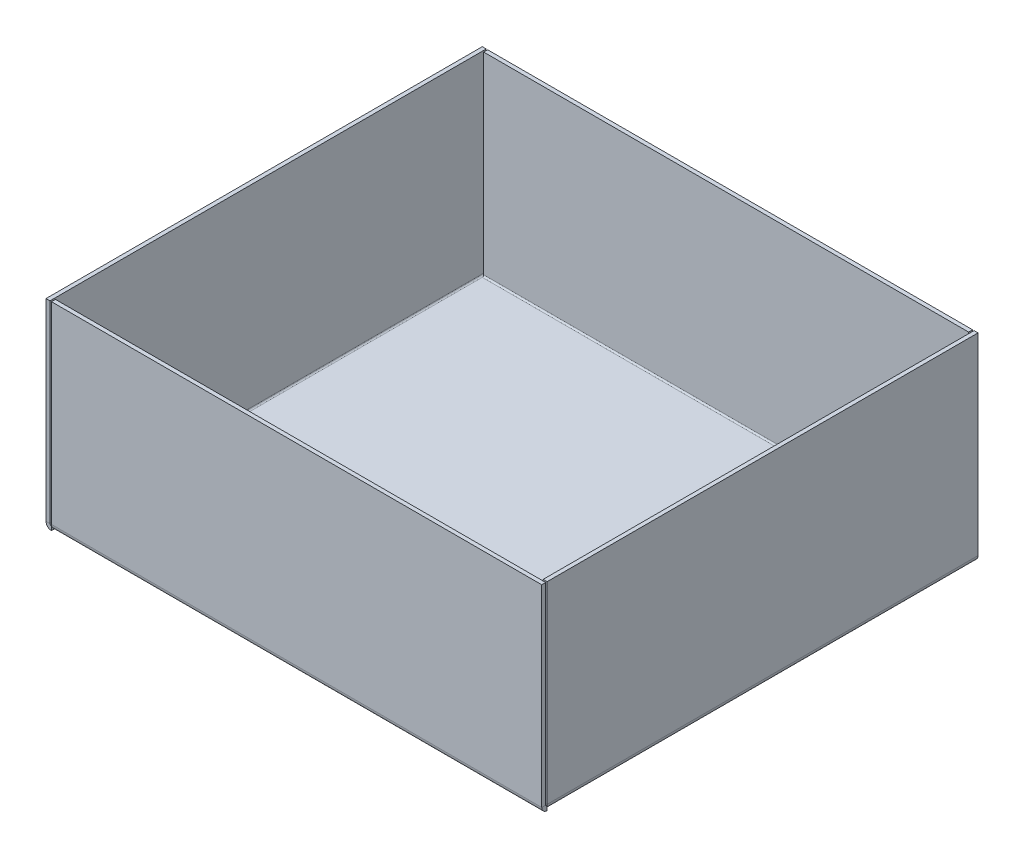
ISO-10303-21;
HEADER;
FILE_DESCRIPTION(('STEP AP214'),'2;1');
FILE_NAME('part.step','',(''),(''),'','','');
FILE_SCHEMA(('AUTOMOTIVE_DESIGN { 1 0 10303 214 1 1 1 1 }'));
ENDSEC;
DATA;
#1=APPLICATION_CONTEXT('core data for automotive mechanical design processes');
#2=APPLICATION_PROTOCOL_DEFINITION('international standard','automotive_design',2000,#1);
#3=PRODUCT_CONTEXT('',#1,'mechanical');
#4=PRODUCT('Part','Part','',(#3));
#5=PRODUCT_RELATED_PRODUCT_CATEGORY('part','',(#4));
#6=PRODUCT_DEFINITION_FORMATION('','',#4);
#7=PRODUCT_DEFINITION_CONTEXT('part definition',#1,'design');
#8=PRODUCT_DEFINITION('design','',#6,#7);
#9=PRODUCT_DEFINITION_SHAPE('','',#8);
#10=(LENGTH_UNIT() NAMED_UNIT(*) SI_UNIT(.MILLI.,.METRE.));
#11=(NAMED_UNIT(*) PLANE_ANGLE_UNIT() SI_UNIT($,.RADIAN.));
#12=(NAMED_UNIT(*) SI_UNIT($,.STERADIAN.) SOLID_ANGLE_UNIT());
#13=UNCERTAINTY_MEASURE_WITH_UNIT(LENGTH_MEASURE(1.E-05),#10,'distance_accuracy_value','');
#14=(GEOMETRIC_REPRESENTATION_CONTEXT(3) GLOBAL_UNCERTAINTY_ASSIGNED_CONTEXT((#13)) GLOBAL_UNIT_ASSIGNED_CONTEXT((#10,
#11,#12)) REPRESENTATION_CONTEXT('',''));
#15=CARTESIAN_POINT('',(0.,0.,0.));
#16=DIRECTION('',(0.,0.,1.));
#17=DIRECTION('',(1.,0.,0.));
#18=AXIS2_PLACEMENT_3D('',#15,#16,#17);
#19=CARTESIAN_POINT('',(-122.2634,0.,-110.));
#20=DIRECTION('',(1.,0.,0.));
#21=DIRECTION('',(0.,0.,-1.));
#22=AXIS2_PLACEMENT_3D('',#19,#20,#21);
#23=PLANE('',#22);
#24=DIRECTION('',(0.,0.,1.));
#25=VECTOR('',#24,1.);
#26=CARTESIAN_POINT('',(-122.2634,0.,-110.));
#27=LINE('',#26,#25);
#28=CARTESIAN_POINT('',(-122.2634,0.,-110.));
#29=VERTEX_POINT('',#28);
#30=CARTESIAN_POINT('',(-122.2634,0.,-109.899002397935));
#31=VERTEX_POINT('',#30);
#32=EDGE_CURVE('E379',#29,#31,#27,.T.);
#33=ORIENTED_EDGE('',*,*,#32,.T.);
#34=CARTESIAN_POINT('',(-122.2634,0.736600000000013,-107.2634));
#35=DIRECTION('',(-1.,0.,0.));
#36=DIRECTION('',(0.,0.,1.));
#37=AXIS2_PLACEMENT_3D('',#34,#35,#36);
#38=CIRCLE('',#37,2.7366);
#39=CARTESIAN_POINT('',(-122.2634,-1.99999999999999,-107.2634));
#40=VERTEX_POINT('',#39);
#41=EDGE_CURVE('E13',#31,#40,#38,.T.);
#42=ORIENTED_EDGE('',*,*,#41,.T.);
#43=DIRECTION('',(0.,0.,1.));
#44=VECTOR('',#43,1.);
#45=CARTESIAN_POINT('',(-122.2634,-2.,110.));
#46=LINE('',#45,#44);
#47=CARTESIAN_POINT('',(-122.2634,-2.,-110.));
#48=VERTEX_POINT('',#47);
#49=EDGE_CURVE('E383',#48,#40,#46,.T.);
#50=ORIENTED_EDGE('',*,*,#49,.F.);
#51=DIRECTION('',(0.,-1.,0.));
#52=VECTOR('',#51,1.);
#53=CARTESIAN_POINT('',(-122.2634,0.,-110.));
#54=LINE('',#53,#52);
#55=EDGE_CURVE('E131',#29,#48,#54,.T.);
#56=ORIENTED_EDGE('',*,*,#55,.F.);
#57=EDGE_LOOP('',(#33,#42,#50,#56));
#58=FACE_BOUND('',#57,.T.);
#59=ADVANCED_FACE('F121',(#58),#23,.T.);
#60=CARTESIAN_POINT('',(122.2634,0.,-107.2634));
#61=DIRECTION('',(-1.,0.,0.));
#62=DIRECTION('',(0.,0.,1.));
#63=AXIS2_PLACEMENT_3D('',#60,#61,#62);
#64=PLANE('',#63);
#65=DIRECTION('',(0.,0.,-1.));
#66=VECTOR('',#65,1.);
#67=CARTESIAN_POINT('',(122.2634,-1.99999999999999,-110.));
#68=LINE('',#67,#66);
#69=CARTESIAN_POINT('',(122.2634,-1.99999999999999,-110.));
#70=VERTEX_POINT('',#69);
#71=CARTESIAN_POINT('',(122.2634,-1.99999999999999,-107.2634));
#72=VERTEX_POINT('',#71);
#73=EDGE_CURVE('E432',#70,#72,#68,.F.);
#74=ORIENTED_EDGE('',*,*,#73,.T.);
#75=CARTESIAN_POINT('',(122.2634,0.736600000000013,-107.2634));
#76=DIRECTION('',(-1.,0.,0.));
#77=DIRECTION('',(0.,0.,1.));
#78=AXIS2_PLACEMENT_3D('',#75,#76,#77);
#79=CIRCLE('',#78,2.7366);
#80=CARTESIAN_POINT('',(122.2634,0.,-109.899002397935));
#81=VERTEX_POINT('',#80);
#82=EDGE_CURVE('E367',#72,#81,#79,.F.);
#83=ORIENTED_EDGE('',*,*,#82,.T.);
#84=DIRECTION('',(0.,0.,-1.));
#85=VECTOR('',#84,1.);
#86=CARTESIAN_POINT('',(122.2634,0.,-110.));
#87=LINE('',#86,#85);
#88=CARTESIAN_POINT('',(122.2634,0.,-110.));
#89=VERTEX_POINT('',#88);
#90=EDGE_CURVE('E450',#89,#81,#87,.F.);
#91=ORIENTED_EDGE('',*,*,#90,.F.);
#92=DIRECTION('',(0.,-1.,0.));
#93=VECTOR('',#92,1.);
#94=CARTESIAN_POINT('',(122.2634,0.,-110.));
#95=LINE('',#94,#93);
#96=EDGE_CURVE('E442',#89,#70,#95,.T.);
#97=ORIENTED_EDGE('',*,*,#96,.T.);
#98=EDGE_LOOP('',(#74,#83,#91,#97));
#99=FACE_BOUND('',#98,.T.);
#100=ADVANCED_FACE('F656',(#99),#64,.T.);
#101=CARTESIAN_POINT('',(0.,-2.,0.));
#102=DIRECTION('',(0.,-1.,0.));
#103=DIRECTION('',(0.,0.,-1.));
#104=AXIS2_PLACEMENT_3D('',#101,#102,#103);
#105=PLANE('',#104);
#106=DIRECTION('',(0.,0.,1.));
#107=VECTOR('',#106,1.);
#108=CARTESIAN_POINT('',(-122.2634,-2.,110.));
#109=LINE('',#108,#107);
#110=CARTESIAN_POINT('',(-122.2634,-2.,107.2634));
#111=VERTEX_POINT('',#110);
#112=EDGE_CURVE('E585',#111,#40,#109,.F.);
#113=ORIENTED_EDGE('',*,*,#112,.T.);
#114=DIRECTION('',(-1.,0.,0.));
#115=VECTOR('',#114,1.);
#116=CARTESIAN_POINT('',(-122.2634,-1.99999999999999,-107.2634));
#117=LINE('',#116,#115);
#118=EDGE_CURVE('E309',#40,#72,#117,.F.);
#119=ORIENTED_EDGE('',*,*,#118,.T.);
#120=CARTESIAN_POINT('',(122.2634,-1.99999999999999,107.2634));
#121=VERTEX_POINT('',#120);
#122=EDGE_CURVE('E437',#72,#121,#68,.F.);
#123=ORIENTED_EDGE('',*,*,#122,.T.);
#124=DIRECTION('',(1.,0.,0.));
#125=VECTOR('',#124,1.);
#126=CARTESIAN_POINT('',(125.,-2.,107.2634));
#127=LINE('',#126,#125);
#128=EDGE_CURVE('E510',#121,#111,#127,.F.);
#129=ORIENTED_EDGE('',*,*,#128,.T.);
#130=EDGE_LOOP('',(#113,#119,#123,#129));
#131=FACE_BOUND('',#130,.T.);
#132=ADVANCED_FACE('F662',(#131),#105,.T.);
#133=CARTESIAN_POINT('',(0.,0.,0.));
#134=DIRECTION('',(0.,-1.,0.));
#135=DIRECTION('',(0.,0.,-1.));
#136=AXIS2_PLACEMENT_3D('',#133,#134,#135);
#137=PLANE('',#136);
#138=DIRECTION('',(-1.,0.,0.));
#139=VECTOR('',#138,1.);
#140=CARTESIAN_POINT('',(-122.2634,0.,-107.2634));
#141=LINE('',#140,#139);
#142=CARTESIAN_POINT('',(-122.2634,0.,-107.2634));
#143=VERTEX_POINT('',#142);
#144=CARTESIAN_POINT('',(122.2634,0.,-107.2634));
#145=VERTEX_POINT('',#144);
#146=EDGE_CURVE('E374',#143,#145,#141,.F.);
#147=ORIENTED_EDGE('',*,*,#146,.F.);
#148=DIRECTION('',(0.,0.,1.));
#149=VECTOR('',#148,1.);
#150=CARTESIAN_POINT('',(-122.2634,0.,110.));
#151=LINE('',#150,#149);
#152=CARTESIAN_POINT('',(-122.2634,0.,107.2634));
#153=VERTEX_POINT('',#152);
#154=EDGE_CURVE('E602',#153,#143,#151,.F.);
#155=ORIENTED_EDGE('',*,*,#154,.F.);
#156=DIRECTION('',(1.,0.,0.));
#157=VECTOR('',#156,1.);
#158=CARTESIAN_POINT('',(125.,0.,107.2634));
#159=LINE('',#158,#157);
#160=CARTESIAN_POINT('',(122.2634,0.,107.2634));
#161=VERTEX_POINT('',#160);
#162=EDGE_CURVE('E529',#161,#153,#159,.F.);
#163=ORIENTED_EDGE('',*,*,#162,.F.);
#164=EDGE_CURVE('E148',#145,#161,#87,.F.);
#165=ORIENTED_EDGE('',*,*,#164,.F.);
#166=EDGE_LOOP('',(#147,#155,#163,#165));
#167=FACE_BOUND('',#166,.T.);
#168=ADVANCED_FACE('F123',(#167),#137,.F.);
#169=CARTESIAN_POINT('',(122.2634,0.,107.2634));
#170=DIRECTION('',(0.,0.,-1.));
#171=DIRECTION('',(0.,1.,0.));
#172=AXIS2_PLACEMENT_3D('',#169,#170,#171);
#173=PLANE('',#172);
#174=CARTESIAN_POINT('',(125.,-2.,107.2634));
#175=VERTEX_POINT('',#174);
#176=EDGE_CURVE('E505',#175,#121,#127,.F.);
#177=ORIENTED_EDGE('',*,*,#176,.T.);
#178=CARTESIAN_POINT('',(122.2634,0.736600000000013,107.2634));
#179=DIRECTION('',(0.,0.,-1.));
#180=DIRECTION('',(-1.,0.,0.));
#181=AXIS2_PLACEMENT_3D('',#178,#179,#180);
#182=CIRCLE('',#181,2.7366);
#183=CARTESIAN_POINT('',(124.899002397935,0.,107.2634));
#184=VERTEX_POINT('',#183);
#185=EDGE_CURVE('E438',#121,#184,#182,.F.);
#186=ORIENTED_EDGE('',*,*,#185,.T.);
#187=CARTESIAN_POINT('',(125.,0.,107.2634));
#188=VERTEX_POINT('',#187);
#189=EDGE_CURVE('E524',#188,#184,#159,.F.);
#190=ORIENTED_EDGE('',*,*,#189,.F.);
#191=DIRECTION('',(0.,-1.,0.));
#192=VECTOR('',#191,1.);
#193=CARTESIAN_POINT('',(125.,0.,107.2634));
#194=LINE('',#193,#192);
#195=EDGE_CURVE('E515',#188,#175,#194,.T.);
#196=ORIENTED_EDGE('',*,*,#195,.T.);
#197=EDGE_LOOP('',(#177,#186,#190,#196));
#198=FACE_BOUND('',#197,.T.);
#199=ADVANCED_FACE('F704',(#198),#173,.T.);
#200=CARTESIAN_POINT('',(-122.2634,0.,107.2634));
#201=DIRECTION('',(1.,0.,0.));
#202=DIRECTION('',(0.,0.,-1.));
#203=AXIS2_PLACEMENT_3D('',#200,#201,#202);
#204=PLANE('',#203);
#205=CARTESIAN_POINT('',(-122.2634,-2.,110.));
#206=VERTEX_POINT('',#205);
#207=EDGE_CURVE('E580',#206,#111,#109,.F.);
#208=ORIENTED_EDGE('',*,*,#207,.T.);
#209=CARTESIAN_POINT('',(-122.2634,0.736600000000004,107.2634));
#210=DIRECTION('',(1.,0.,0.));
#211=DIRECTION('',(0.,0.,-1.));
#212=AXIS2_PLACEMENT_3D('',#209,#210,#211);
#213=CIRCLE('',#212,2.7366);
#214=CARTESIAN_POINT('',(-122.2634,0.,109.899002397935));
#215=VERTEX_POINT('',#214);
#216=EDGE_CURVE('E511',#111,#215,#213,.F.);
#217=ORIENTED_EDGE('',*,*,#216,.T.);
#218=CARTESIAN_POINT('',(-122.2634,0.,110.));
#219=VERTEX_POINT('',#218);
#220=EDGE_CURVE('E597',#219,#215,#151,.F.);
#221=ORIENTED_EDGE('',*,*,#220,.F.);
#222=DIRECTION('',(0.,-1.,0.));
#223=VECTOR('',#222,1.);
#224=CARTESIAN_POINT('',(-122.2634,0.,110.));
#225=LINE('',#224,#223);
#226=EDGE_CURVE('E125',#219,#206,#225,.T.);
#227=ORIENTED_EDGE('',*,*,#226,.T.);
#228=EDGE_LOOP('',(#208,#217,#221,#227));
#229=FACE_BOUND('',#228,.T.);
#230=ADVANCED_FACE('F613',(#229),#204,.T.);
#231=CARTESIAN_POINT('',(-122.2634,0.736600000000006,-110.));
#232=DIRECTION('',(0.,0.,-1.));
#233=DIRECTION('',(-1.,0.,0.));
#234=AXIS2_PLACEMENT_3D('',#231,#232,#233);
#235=PLANE('',#234);
#236=DIRECTION('',(-1.,0.,0.));
#237=VECTOR('',#236,1.);
#238=CARTESIAN_POINT('',(-125.,0.736600000000004,-110.));
#239=LINE('',#238,#237);
#240=CARTESIAN_POINT('',(-123.,0.736600000000004,-110.));
#241=VERTEX_POINT('',#240);
#242=CARTESIAN_POINT('',(-125.,0.736599999999997,-110.));
#243=VERTEX_POINT('',#242);
#244=EDGE_CURVE('E535',#241,#243,#239,.T.);
#245=ORIENTED_EDGE('',*,*,#244,.F.);
#246=CARTESIAN_POINT('',(-122.2634,0.736600000000006,-110.));
#247=DIRECTION('',(0.,0.,1.));
#248=DIRECTION('',(1.,0.,0.));
#249=AXIS2_PLACEMENT_3D('',#246,#247,#248);
#250=CIRCLE('',#249,0.736600000000004);
#251=EDGE_CURVE('E593',#29,#241,#250,.F.);
#252=ORIENTED_EDGE('',*,*,#251,.F.);
#253=ORIENTED_EDGE('',*,*,#55,.T.);
#254=CARTESIAN_POINT('',(-122.2634,0.736600000000006,-110.));
#255=DIRECTION('',(0.,0.,1.));
#256=DIRECTION('',(1.,0.,0.));
#257=AXIS2_PLACEMENT_3D('',#254,#255,#256);
#258=CIRCLE('',#257,2.7366);
#259=EDGE_CURVE('E584',#48,#243,#258,.F.);
#260=ORIENTED_EDGE('',*,*,#259,.T.);
#261=EDGE_LOOP('',(#245,#252,#253,#260));
#262=FACE_BOUND('',#261,.T.);
#263=ADVANCED_FACE('F638',(#262),#235,.T.);
#264=CARTESIAN_POINT('',(-122.2634,0.736600000000006,110.));
#265=DIRECTION('',(0.,0.,-1.));
#266=DIRECTION('',(-1.,0.,0.));
#267=AXIS2_PLACEMENT_3D('',#264,#265,#266);
#268=PLANE('',#267);
#269=CARTESIAN_POINT('',(-122.2634,0.736600000000006,110.));
#270=DIRECTION('',(0.,0.,1.));
#271=DIRECTION('',(1.,0.,0.));
#272=AXIS2_PLACEMENT_3D('',#269,#270,#271);
#273=CIRCLE('',#272,0.736600000000004);
#274=CARTESIAN_POINT('',(-123.,0.736600000000004,110.));
#275=VERTEX_POINT('',#274);
#276=EDGE_CURVE('E539',#275,#219,#273,.T.);
#277=ORIENTED_EDGE('',*,*,#276,.F.);
#278=DIRECTION('',(-1.,0.,0.));
#279=VECTOR('',#278,1.);
#280=CARTESIAN_POINT('',(-123.,0.736600000000004,110.));
#281=LINE('',#280,#279);
#282=CARTESIAN_POINT('',(-125.,0.736599999999997,110.));
#283=VERTEX_POINT('',#282);
#284=EDGE_CURVE('E570',#275,#283,#281,.T.);
#285=ORIENTED_EDGE('',*,*,#284,.T.);
#286=CARTESIAN_POINT('',(-122.2634,0.736600000000006,110.));
#287=DIRECTION('',(0.,0.,1.));
#288=DIRECTION('',(1.,0.,0.));
#289=AXIS2_PLACEMENT_3D('',#286,#287,#288);
#290=CIRCLE('',#289,2.7366);
#291=EDGE_CURVE('E589',#283,#206,#290,.T.);
#292=ORIENTED_EDGE('',*,*,#291,.T.);
#293=ORIENTED_EDGE('',*,*,#226,.F.);
#294=EDGE_LOOP('',(#277,#285,#292,#293));
#295=FACE_BOUND('',#294,.T.);
#296=ADVANCED_FACE('F620',(#295),#268,.F.);
#297=CARTESIAN_POINT('',(-122.2634,0.736600000000006,110.));
#298=DIRECTION('',(0.,0.,1.));
#299=DIRECTION('',(-1.,0.,0.));
#300=AXIS2_PLACEMENT_3D('',#297,#298,#299);
#301=CYLINDRICAL_SURFACE('',#300,2.7366);
#302=ORIENTED_EDGE('',*,*,#207,.F.);
#303=ORIENTED_EDGE('',*,*,#291,.F.);
#304=DIRECTION('',(0.,0.,1.));
#305=VECTOR('',#304,1.);
#306=CARTESIAN_POINT('',(-125.,0.736599999999997,0.));
#307=LINE('',#306,#305);
#308=EDGE_CURVE('E566',#243,#283,#307,.T.);
#309=ORIENTED_EDGE('',*,*,#308,.F.);
#310=ORIENTED_EDGE('',*,*,#259,.F.);
#311=ORIENTED_EDGE('',*,*,#49,.T.);
#312=ORIENTED_EDGE('',*,*,#112,.F.);
#313=EDGE_LOOP('',(#302,#303,#309,#310,#311,#312));
#314=FACE_BOUND('',#313,.T.);
#315=ADVANCED_FACE('F618',(#314),#301,.T.);
#316=CARTESIAN_POINT('',(-122.2634,0.736600000000006,110.));
#317=DIRECTION('',(0.,0.,1.));
#318=DIRECTION('',(-1.,0.,0.));
#319=AXIS2_PLACEMENT_3D('',#316,#317,#318);
#320=CYLINDRICAL_SURFACE('',#319,0.736600000000004);
#321=ORIENTED_EDGE('',*,*,#220,.T.);
#322=EDGE_CURVE('E601',#215,#153,#151,.F.);
#323=ORIENTED_EDGE('',*,*,#322,.T.);
#324=ORIENTED_EDGE('',*,*,#154,.T.);
#325=EDGE_CURVE('E370',#31,#143,#27,.T.);
#326=ORIENTED_EDGE('',*,*,#325,.F.);
#327=ORIENTED_EDGE('',*,*,#32,.F.);
#328=ORIENTED_EDGE('',*,*,#251,.T.);
#329=DIRECTION('',(0.,0.,-1.));
#330=VECTOR('',#329,1.);
#331=CARTESIAN_POINT('',(-123.,0.736600000000004,-110.));
#332=LINE('',#331,#330);
#333=EDGE_CURVE('E574',#241,#275,#332,.F.);
#334=ORIENTED_EDGE('',*,*,#333,.T.);
#335=ORIENTED_EDGE('',*,*,#276,.T.);
#336=EDGE_LOOP('',(#321,#323,#324,#326,#327,#328,#334,#335));
#337=FACE_BOUND('',#336,.T.);
#338=ADVANCED_FACE('F642',(#337),#320,.F.);
#339=CARTESIAN_POINT('',(-125.,0.,110.));
#340=DIRECTION('',(0.,0.,1.));
#341=DIRECTION('',(1.,0.,0.));
#342=AXIS2_PLACEMENT_3D('',#339,#340,#341);
#343=PLANE('',#342);
#344=DIRECTION('',(0.,-1.,0.));
#345=VECTOR('',#344,1.);
#346=CARTESIAN_POINT('',(-125.,0.,110.));
#347=LINE('',#346,#345);
#348=CARTESIAN_POINT('',(-125.,98.,110.));
#349=VERTEX_POINT('',#348);
#350=EDGE_CURVE('E544',#349,#283,#347,.T.);
#351=ORIENTED_EDGE('',*,*,#350,.T.);
#352=ORIENTED_EDGE('',*,*,#284,.F.);
#353=DIRECTION('',(0.,1.,0.));
#354=VECTOR('',#353,1.);
#355=CARTESIAN_POINT('',(-123.,-4.24830239014728E-13,110.));
#356=LINE('',#355,#354);
#357=CARTESIAN_POINT('',(-123.,98.,110.));
#358=VERTEX_POINT('',#357);
#359=EDGE_CURVE('E555',#358,#275,#356,.F.);
#360=ORIENTED_EDGE('',*,*,#359,.F.);
#361=DIRECTION('',(1.,0.,0.));
#362=VECTOR('',#361,1.);
#363=CARTESIAN_POINT('',(-125.,98.,110.));
#364=LINE('',#363,#362);
#365=EDGE_CURVE('E536',#349,#358,#364,.T.);
#366=ORIENTED_EDGE('',*,*,#365,.F.);
#367=EDGE_LOOP('',(#351,#352,#360,#366));
#368=FACE_BOUND('',#367,.T.);
#369=ADVANCED_FACE('F630',(#368),#343,.T.);
#370=CARTESIAN_POINT('',(-125.,98.,-110.));
#371=DIRECTION('',(0.,0.,-1.));
#372=DIRECTION('',(-1.,0.,0.));
#373=AXIS2_PLACEMENT_3D('',#370,#371,#372);
#374=PLANE('',#373);
#375=DIRECTION('',(0.,-1.,0.));
#376=VECTOR('',#375,1.);
#377=CARTESIAN_POINT('',(-123.,-4.24830239014728E-13,-110.));
#378=LINE('',#377,#376);
#379=CARTESIAN_POINT('',(-123.,98.,-110.));
#380=VERTEX_POINT('',#379);
#381=EDGE_CURVE('E563',#241,#380,#378,.F.);
#382=ORIENTED_EDGE('',*,*,#381,.F.);
#383=ORIENTED_EDGE('',*,*,#244,.T.);
#384=DIRECTION('',(0.,1.,0.));
#385=VECTOR('',#384,1.);
#386=CARTESIAN_POINT('',(-125.,98.,-110.));
#387=LINE('',#386,#385);
#388=CARTESIAN_POINT('',(-125.,98.,-110.));
#389=VERTEX_POINT('',#388);
#390=EDGE_CURVE('E552',#243,#389,#387,.T.);
#391=ORIENTED_EDGE('',*,*,#390,.T.);
#392=DIRECTION('',(1.,0.,0.));
#393=VECTOR('',#392,1.);
#394=CARTESIAN_POINT('',(-125.,98.,-110.));
#395=LINE('',#394,#393);
#396=EDGE_CURVE('E540',#389,#380,#395,.T.);
#397=ORIENTED_EDGE('',*,*,#396,.T.);
#398=EDGE_LOOP('',(#382,#383,#391,#397));
#399=FACE_BOUND('',#398,.T.);
#400=ADVANCED_FACE('F637',(#399),#374,.T.);
#401=CARTESIAN_POINT('',(-125.,-4.31813201692414E-13,0.));
#402=DIRECTION('',(-1.,0.,0.));
#403=DIRECTION('',(0.,-1.,0.));
#404=AXIS2_PLACEMENT_3D('',#401,#402,#403);
#405=PLANE('',#404);
#406=ORIENTED_EDGE('',*,*,#390,.F.);
#407=ORIENTED_EDGE('',*,*,#308,.T.);
#408=ORIENTED_EDGE('',*,*,#350,.F.);
#409=DIRECTION('',(0.,0.,1.));
#410=VECTOR('',#409,1.);
#411=CARTESIAN_POINT('',(-125.,98.,110.));
#412=LINE('',#411,#410);
#413=EDGE_CURVE('E548',#389,#349,#412,.T.);
#414=ORIENTED_EDGE('',*,*,#413,.F.);
#415=EDGE_LOOP('',(#406,#407,#408,#414));
#416=FACE_BOUND('',#415,.T.);
#417=ADVANCED_FACE('F627',(#416),#405,.T.);
#418=CARTESIAN_POINT('',(-123.,-4.24830239014728E-13,0.));
#419=DIRECTION('',(-1.,0.,0.));
#420=DIRECTION('',(0.,-1.,0.));
#421=AXIS2_PLACEMENT_3D('',#418,#419,#420);
#422=PLANE('',#421);
#423=ORIENTED_EDGE('',*,*,#333,.F.);
#424=ORIENTED_EDGE('',*,*,#381,.T.);
#425=DIRECTION('',(0.,0.,-1.));
#426=VECTOR('',#425,1.);
#427=CARTESIAN_POINT('',(-123.,98.,0.));
#428=LINE('',#427,#426);
#429=EDGE_CURVE('E559',#380,#358,#428,.F.);
#430=ORIENTED_EDGE('',*,*,#429,.T.);
#431=ORIENTED_EDGE('',*,*,#359,.T.);
#432=EDGE_LOOP('',(#423,#424,#430,#431));
#433=FACE_BOUND('',#432,.T.);
#434=ADVANCED_FACE('F644',(#433),#422,.F.);
#435=CARTESIAN_POINT('',(-125.,98.,110.));
#436=DIRECTION('',(0.,1.,0.));
#437=DIRECTION('',(-1.,0.,0.));
#438=AXIS2_PLACEMENT_3D('',#435,#436,#437);
#439=PLANE('',#438);
#440=ORIENTED_EDGE('',*,*,#429,.F.);
#441=ORIENTED_EDGE('',*,*,#396,.F.);
#442=ORIENTED_EDGE('',*,*,#413,.T.);
#443=ORIENTED_EDGE('',*,*,#365,.T.);
#444=EDGE_LOOP('',(#440,#441,#442,#443));
#445=FACE_BOUND('',#444,.T.);
#446=ADVANCED_FACE('F634',(#445),#439,.T.);
#447=CARTESIAN_POINT('',(-122.2634,0.736600000000004,107.2634));
#448=DIRECTION('',(-1.,0.,0.));
#449=DIRECTION('',(0.,0.,1.));
#450=AXIS2_PLACEMENT_3D('',#447,#448,#449);
#451=PLANE('',#450);
#452=ORIENTED_EDGE('',*,*,#322,.F.);
#453=CARTESIAN_POINT('',(-122.2634,0.736599999999994,110.));
#454=VERTEX_POINT('',#453);
#455=EDGE_CURVE('E509',#215,#454,#213,.F.);
#456=ORIENTED_EDGE('',*,*,#455,.T.);
#457=DIRECTION('',(0.,0.,1.));
#458=VECTOR('',#457,1.);
#459=CARTESIAN_POINT('',(-122.2634,0.736600000000004,110.));
#460=LINE('',#459,#458);
#461=CARTESIAN_POINT('',(-122.2634,0.736600000000001,108.));
#462=VERTEX_POINT('',#461);
#463=EDGE_CURVE('E460',#462,#454,#460,.T.);
#464=ORIENTED_EDGE('',*,*,#463,.F.);
#465=CARTESIAN_POINT('',(-122.2634,0.736600000000004,107.2634));
#466=DIRECTION('',(1.,0.,0.));
#467=DIRECTION('',(0.,0.,-1.));
#468=AXIS2_PLACEMENT_3D('',#465,#466,#467);
#469=CIRCLE('',#468,0.736600000000004);
#470=EDGE_CURVE('E520',#153,#462,#469,.F.);
#471=ORIENTED_EDGE('',*,*,#470,.F.);
#472=EDGE_LOOP('',(#452,#456,#464,#471));
#473=FACE_BOUND('',#472,.T.);
#474=ADVANCED_FACE('F651',(#473),#451,.T.);
#475=CARTESIAN_POINT('',(125.,0.736600000000004,107.2634));
#476=DIRECTION('',(-1.,0.,0.));
#477=DIRECTION('',(0.,0.,1.));
#478=AXIS2_PLACEMENT_3D('',#475,#476,#477);
#479=PLANE('',#478);
#480=CARTESIAN_POINT('',(125.,0.736600000000004,107.2634));
#481=DIRECTION('',(1.,0.,0.));
#482=DIRECTION('',(0.,0.,-1.));
#483=AXIS2_PLACEMENT_3D('',#480,#481,#482);
#484=CIRCLE('',#483,0.736600000000004);
#485=CARTESIAN_POINT('',(125.,0.736600000000001,108.));
#486=VERTEX_POINT('',#485);
#487=EDGE_CURVE('E464',#486,#188,#484,.T.);
#488=ORIENTED_EDGE('',*,*,#487,.F.);
#489=DIRECTION('',(0.,0.,1.));
#490=VECTOR('',#489,1.);
#491=CARTESIAN_POINT('',(125.,0.736600000000004,108.));
#492=LINE('',#491,#490);
#493=CARTESIAN_POINT('',(125.,0.736600000000004,110.));
#494=VERTEX_POINT('',#493);
#495=EDGE_CURVE('E495',#486,#494,#492,.T.);
#496=ORIENTED_EDGE('',*,*,#495,.T.);
#497=CARTESIAN_POINT('',(125.,0.736600000000004,107.2634));
#498=DIRECTION('',(1.,0.,0.));
#499=DIRECTION('',(0.,0.,-1.));
#500=AXIS2_PLACEMENT_3D('',#497,#498,#499);
#501=CIRCLE('',#500,2.7366);
#502=EDGE_CURVE('E516',#494,#175,#501,.T.);
#503=ORIENTED_EDGE('',*,*,#502,.T.);
#504=ORIENTED_EDGE('',*,*,#195,.F.);
#505=EDGE_LOOP('',(#488,#496,#503,#504));
#506=FACE_BOUND('',#505,.T.);
#507=ADVANCED_FACE('F731',(#506),#479,.F.);
#508=CARTESIAN_POINT('',(125.,0.736600000000004,107.2634));
#509=DIRECTION('',(1.,0.,0.));
#510=DIRECTION('',(0.,0.,1.));
#511=AXIS2_PLACEMENT_3D('',#508,#509,#510);
#512=CYLINDRICAL_SURFACE('',#511,2.7366);
#513=ORIENTED_EDGE('',*,*,#176,.F.);
#514=ORIENTED_EDGE('',*,*,#502,.F.);
#515=DIRECTION('',(1.,0.,0.));
#516=VECTOR('',#515,1.);
#517=CARTESIAN_POINT('',(0.,0.736600000000004,110.));
#518=LINE('',#517,#516);
#519=EDGE_CURVE('E491',#454,#494,#518,.T.);
#520=ORIENTED_EDGE('',*,*,#519,.F.);
#521=ORIENTED_EDGE('',*,*,#455,.F.);
#522=ORIENTED_EDGE('',*,*,#216,.F.);
#523=ORIENTED_EDGE('',*,*,#128,.F.);
#524=EDGE_LOOP('',(#513,#514,#520,#521,#522,#523));
#525=FACE_BOUND('',#524,.T.);
#526=ADVANCED_FACE('F728',(#525),#512,.T.);
#527=CARTESIAN_POINT('',(125.,0.736600000000004,107.2634));
#528=DIRECTION('',(1.,0.,0.));
#529=DIRECTION('',(0.,0.,1.));
#530=AXIS2_PLACEMENT_3D('',#527,#528,#529);
#531=CYLINDRICAL_SURFACE('',#530,0.736600000000004);
#532=ORIENTED_EDGE('',*,*,#189,.T.);
#533=EDGE_CURVE('E528',#184,#161,#159,.F.);
#534=ORIENTED_EDGE('',*,*,#533,.T.);
#535=ORIENTED_EDGE('',*,*,#162,.T.);
#536=ORIENTED_EDGE('',*,*,#470,.T.);
#537=DIRECTION('',(-1.,0.,0.));
#538=VECTOR('',#537,1.);
#539=CARTESIAN_POINT('',(-122.2634,0.736600000000004,108.));
#540=LINE('',#539,#538);
#541=EDGE_CURVE('E499',#462,#486,#540,.F.);
#542=ORIENTED_EDGE('',*,*,#541,.T.);
#543=ORIENTED_EDGE('',*,*,#487,.T.);
#544=EDGE_LOOP('',(#532,#534,#535,#536,#542,#543));
#545=FACE_BOUND('',#544,.T.);
#546=ADVANCED_FACE('F720',(#545),#531,.F.);
#547=CARTESIAN_POINT('',(125.,0.,110.));
#548=DIRECTION('',(1.,0.,0.));
#549=DIRECTION('',(0.,0.,-1.));
#550=AXIS2_PLACEMENT_3D('',#547,#548,#549);
#551=PLANE('',#550);
#552=DIRECTION('',(0.,-1.,0.));
#553=VECTOR('',#552,1.);
#554=CARTESIAN_POINT('',(125.,0.,110.));
#555=LINE('',#554,#553);
#556=CARTESIAN_POINT('',(125.,98.,110.));
#557=VERTEX_POINT('',#556);
#558=EDGE_CURVE('E469',#557,#494,#555,.T.);
#559=ORIENTED_EDGE('',*,*,#558,.T.);
#560=ORIENTED_EDGE('',*,*,#495,.F.);
#561=DIRECTION('',(0.,1.,0.));
#562=VECTOR('',#561,1.);
#563=CARTESIAN_POINT('',(125.,-3.89427719096834E-13,108.));
#564=LINE('',#563,#562);
#565=CARTESIAN_POINT('',(125.,98.,108.));
#566=VERTEX_POINT('',#565);
#567=EDGE_CURVE('E480',#566,#486,#564,.F.);
#568=ORIENTED_EDGE('',*,*,#567,.F.);
#569=DIRECTION('',(0.,0.,-1.));
#570=VECTOR('',#569,1.);
#571=CARTESIAN_POINT('',(125.,98.,110.));
#572=LINE('',#571,#570);
#573=EDGE_CURVE('E461',#557,#566,#572,.T.);
#574=ORIENTED_EDGE('',*,*,#573,.F.);
#575=EDGE_LOOP('',(#559,#560,#568,#574));
#576=FACE_BOUND('',#575,.T.);
#577=ADVANCED_FACE('F717',(#576),#551,.T.);
#578=CARTESIAN_POINT('',(-122.2634,98.,110.));
#579=DIRECTION('',(-1.,0.,0.));
#580=DIRECTION('',(0.,0.,1.));
#581=AXIS2_PLACEMENT_3D('',#578,#579,#580);
#582=PLANE('',#581);
#583=DIRECTION('',(0.,-1.,0.));
#584=VECTOR('',#583,1.);
#585=CARTESIAN_POINT('',(-122.2634,-3.89427719096834E-13,108.));
#586=LINE('',#585,#584);
#587=CARTESIAN_POINT('',(-122.2634,98.,108.));
#588=VERTEX_POINT('',#587);
#589=EDGE_CURVE('E488',#462,#588,#586,.F.);
#590=ORIENTED_EDGE('',*,*,#589,.F.);
#591=ORIENTED_EDGE('',*,*,#463,.T.);
#592=DIRECTION('',(0.,1.,0.));
#593=VECTOR('',#592,1.);
#594=CARTESIAN_POINT('',(-122.2634,98.,110.));
#595=LINE('',#594,#593);
#596=CARTESIAN_POINT('',(-122.2634,98.,110.));
#597=VERTEX_POINT('',#596);
#598=EDGE_CURVE('E477',#454,#597,#595,.T.);
#599=ORIENTED_EDGE('',*,*,#598,.T.);
#600=DIRECTION('',(0.,0.,-1.));
#601=VECTOR('',#600,1.);
#602=CARTESIAN_POINT('',(-122.2634,98.,110.));
#603=LINE('',#602,#601);
#604=EDGE_CURVE('E465',#597,#588,#603,.T.);
#605=ORIENTED_EDGE('',*,*,#604,.T.);
#606=EDGE_LOOP('',(#590,#591,#599,#605));
#607=FACE_BOUND('',#606,.T.);
#608=ADVANCED_FACE('F712',(#607),#582,.T.);
#609=CARTESIAN_POINT('',(0.,-3.9641068177452E-13,110.));
#610=DIRECTION('',(0.,0.,1.));
#611=DIRECTION('',(0.,-1.,0.));
#612=AXIS2_PLACEMENT_3D('',#609,#610,#611);
#613=PLANE('',#612);
#614=ORIENTED_EDGE('',*,*,#598,.F.);
#615=ORIENTED_EDGE('',*,*,#519,.T.);
#616=ORIENTED_EDGE('',*,*,#558,.F.);
#617=DIRECTION('',(1.,0.,0.));
#618=VECTOR('',#617,1.);
#619=CARTESIAN_POINT('',(125.,98.,110.));
#620=LINE('',#619,#618);
#621=EDGE_CURVE('E473',#597,#557,#620,.T.);
#622=ORIENTED_EDGE('',*,*,#621,.F.);
#623=EDGE_LOOP('',(#614,#615,#616,#622));
#624=FACE_BOUND('',#623,.T.);
#625=ADVANCED_FACE('F708',(#624),#613,.T.);
#626=CARTESIAN_POINT('',(0.,-3.89427719096834E-13,108.));
#627=DIRECTION('',(0.,0.,1.));
#628=DIRECTION('',(0.,-1.,0.));
#629=AXIS2_PLACEMENT_3D('',#626,#627,#628);
#630=PLANE('',#629);
#631=ORIENTED_EDGE('',*,*,#541,.F.);
#632=ORIENTED_EDGE('',*,*,#589,.T.);
#633=DIRECTION('',(-1.,0.,0.));
#634=VECTOR('',#633,1.);
#635=CARTESIAN_POINT('',(0.,98.,108.));
#636=LINE('',#635,#634);
#637=EDGE_CURVE('E484',#588,#566,#636,.F.);
#638=ORIENTED_EDGE('',*,*,#637,.T.);
#639=ORIENTED_EDGE('',*,*,#567,.T.);
#640=EDGE_LOOP('',(#631,#632,#638,#639));
#641=FACE_BOUND('',#640,.T.);
#642=ADVANCED_FACE('F711',(#641),#630,.F.);
#643=CARTESIAN_POINT('',(125.,98.,110.));
#644=DIRECTION('',(0.,1.,0.));
#645=DIRECTION('',(0.,0.,1.));
#646=AXIS2_PLACEMENT_3D('',#643,#644,#645);
#647=PLANE('',#646);
#648=ORIENTED_EDGE('',*,*,#637,.F.);
#649=ORIENTED_EDGE('',*,*,#604,.F.);
#650=ORIENTED_EDGE('',*,*,#621,.T.);
#651=ORIENTED_EDGE('',*,*,#573,.T.);
#652=EDGE_LOOP('',(#648,#649,#650,#651));
#653=FACE_BOUND('',#652,.T.);
#654=ADVANCED_FACE('F699',(#653),#647,.T.);
#655=CARTESIAN_POINT('',(122.2634,0.736600000000013,107.2634));
#656=DIRECTION('',(0.,0.,1.));
#657=DIRECTION('',(1.,0.,0.));
#658=AXIS2_PLACEMENT_3D('',#655,#656,#657);
#659=PLANE('',#658);
#660=ORIENTED_EDGE('',*,*,#533,.F.);
#661=CARTESIAN_POINT('',(125.,0.736600000000004,107.2634));
#662=VERTEX_POINT('',#661);
#663=EDGE_CURVE('E436',#184,#662,#182,.F.);
#664=ORIENTED_EDGE('',*,*,#663,.T.);
#665=DIRECTION('',(1.,0.,0.));
#666=VECTOR('',#665,1.);
#667=CARTESIAN_POINT('',(125.,0.73659999999999,107.2634));
#668=LINE('',#667,#666);
#669=CARTESIAN_POINT('',(123.,0.736600000000011,107.2634));
#670=VERTEX_POINT('',#669);
#671=EDGE_CURVE('E387',#670,#662,#668,.T.);
#672=ORIENTED_EDGE('',*,*,#671,.F.);
#673=CARTESIAN_POINT('',(122.2634,0.736600000000013,107.2634));
#674=DIRECTION('',(0.,0.,-1.));
#675=DIRECTION('',(-1.,0.,0.));
#676=AXIS2_PLACEMENT_3D('',#673,#674,#675);
#677=CIRCLE('',#676,0.736600000000004);
#678=EDGE_CURVE('E447',#161,#670,#677,.F.);
#679=ORIENTED_EDGE('',*,*,#678,.F.);
#680=EDGE_LOOP('',(#660,#664,#672,#679));
#681=FACE_BOUND('',#680,.T.);
#682=ADVANCED_FACE('F696',(#681),#659,.T.);
#683=CARTESIAN_POINT('',(122.2634,0.736600000000013,-110.));
#684=DIRECTION('',(0.,0.,1.));
#685=DIRECTION('',(1.,0.,0.));
#686=AXIS2_PLACEMENT_3D('',#683,#684,#685);
#687=PLANE('',#686);
#688=CARTESIAN_POINT('',(122.2634,0.736600000000013,-110.));
#689=DIRECTION('',(0.,0.,-1.));
#690=DIRECTION('',(-1.,0.,0.));
#691=AXIS2_PLACEMENT_3D('',#688,#689,#690);
#692=CIRCLE('',#691,0.736600000000004);
#693=CARTESIAN_POINT('',(123.,0.736600000000011,-110.));
#694=VERTEX_POINT('',#693);
#695=EDGE_CURVE('E391',#694,#89,#692,.T.);
#696=ORIENTED_EDGE('',*,*,#695,.F.);
#697=DIRECTION('',(1.,0.,0.));
#698=VECTOR('',#697,1.);
#699=CARTESIAN_POINT('',(123.,0.736600000000018,-110.));
#700=LINE('',#699,#698);
#701=CARTESIAN_POINT('',(125.,0.736600000000011,-110.));
#702=VERTEX_POINT('',#701);
#703=EDGE_CURVE('E422',#694,#702,#700,.T.);
#704=ORIENTED_EDGE('',*,*,#703,.T.);
#705=CARTESIAN_POINT('',(122.2634,0.736600000000013,-110.));
#706=DIRECTION('',(0.,0.,-1.));
#707=DIRECTION('',(-1.,0.,0.));
#708=AXIS2_PLACEMENT_3D('',#705,#706,#707);
#709=CIRCLE('',#708,2.7366);
#710=EDGE_CURVE('E443',#702,#70,#709,.T.);
#711=ORIENTED_EDGE('',*,*,#710,.T.);
#712=ORIENTED_EDGE('',*,*,#96,.F.);
#713=EDGE_LOOP('',(#696,#704,#711,#712));
#714=FACE_BOUND('',#713,.T.);
#715=ADVANCED_FACE('F692',(#714),#687,.F.);
#716=CARTESIAN_POINT('',(122.2634,0.736600000000013,-110.));
#717=DIRECTION('',(0.,0.,-1.));
#718=DIRECTION('',(1.,0.,0.));
#719=AXIS2_PLACEMENT_3D('',#716,#717,#718);
#720=CYLINDRICAL_SURFACE('',#719,2.7366);
#721=ORIENTED_EDGE('',*,*,#73,.F.);
#722=ORIENTED_EDGE('',*,*,#710,.F.);
#723=DIRECTION('',(0.,0.,-1.));
#724=VECTOR('',#723,1.);
#725=CARTESIAN_POINT('',(125.,0.736600000000004,0.));
#726=LINE('',#725,#724);
#727=EDGE_CURVE('E418',#662,#702,#726,.T.);
#728=ORIENTED_EDGE('',*,*,#727,.F.);
#729=ORIENTED_EDGE('',*,*,#663,.F.);
#730=ORIENTED_EDGE('',*,*,#185,.F.);
#731=ORIENTED_EDGE('',*,*,#122,.F.);
#732=EDGE_LOOP('',(#721,#722,#728,#729,#730,#731));
#733=FACE_BOUND('',#732,.T.);
#734=ADVANCED_FACE('F689',(#733),#720,.T.);
#735=CARTESIAN_POINT('',(122.2634,0.736600000000013,-110.));
#736=DIRECTION('',(0.,0.,-1.));
#737=DIRECTION('',(1.,0.,0.));
#738=AXIS2_PLACEMENT_3D('',#735,#736,#737);
#739=CYLINDRICAL_SURFACE('',#738,0.736600000000004);
#740=ORIENTED_EDGE('',*,*,#90,.T.);
#741=EDGE_CURVE('E454',#81,#145,#87,.F.);
#742=ORIENTED_EDGE('',*,*,#741,.T.);
#743=ORIENTED_EDGE('',*,*,#164,.T.);
#744=ORIENTED_EDGE('',*,*,#678,.T.);
#745=DIRECTION('',(0.,0.,1.));
#746=VECTOR('',#745,1.);
#747=CARTESIAN_POINT('',(123.,0.736600000000004,107.2634));
#748=LINE('',#747,#746);
#749=EDGE_CURVE('E426',#670,#694,#748,.F.);
#750=ORIENTED_EDGE('',*,*,#749,.T.);
#751=ORIENTED_EDGE('',*,*,#695,.T.);
#752=EDGE_LOOP('',(#740,#742,#743,#744,#750,#751));
#753=FACE_BOUND('',#752,.T.);
#754=ADVANCED_FACE('F680',(#753),#739,.F.);
#755=CARTESIAN_POINT('',(125.,0.,-110.));
#756=DIRECTION('',(0.,0.,-1.));
#757=DIRECTION('',(-1.,0.,0.));
#758=AXIS2_PLACEMENT_3D('',#755,#756,#757);
#759=PLANE('',#758);
#760=DIRECTION('',(0.,-1.,0.));
#761=VECTOR('',#760,1.);
#762=CARTESIAN_POINT('',(125.,0.,-110.));
#763=LINE('',#762,#761);
#764=CARTESIAN_POINT('',(125.,98.,-110.));
#765=VERTEX_POINT('',#764);
#766=EDGE_CURVE('E396',#765,#702,#763,.T.);
#767=ORIENTED_EDGE('',*,*,#766,.T.);
#768=ORIENTED_EDGE('',*,*,#703,.F.);
#769=DIRECTION('',(0.,1.,0.));
#770=VECTOR('',#769,1.);
#771=CARTESIAN_POINT('',(123.,-4.42531498973675E-13,-110.));
#772=LINE('',#771,#770);
#773=CARTESIAN_POINT('',(123.,98.,-110.));
#774=VERTEX_POINT('',#773);
#775=EDGE_CURVE('E407',#774,#694,#772,.F.);
#776=ORIENTED_EDGE('',*,*,#775,.F.);
#777=DIRECTION('',(-1.,0.,0.));
#778=VECTOR('',#777,1.);
#779=CARTESIAN_POINT('',(125.,98.,-110.));
#780=LINE('',#779,#778);
#781=EDGE_CURVE('E388',#765,#774,#780,.T.);
#782=ORIENTED_EDGE('',*,*,#781,.F.);
#783=EDGE_LOOP('',(#767,#768,#776,#782));
#784=FACE_BOUND('',#783,.T.);
#785=ADVANCED_FACE('F677',(#784),#759,.T.);
#786=CARTESIAN_POINT('',(125.,98.,107.2634));
#787=DIRECTION('',(0.,0.,1.));
#788=DIRECTION('',(1.,0.,0.));
#789=AXIS2_PLACEMENT_3D('',#786,#787,#788);
#790=PLANE('',#789);
#791=DIRECTION('',(0.,-1.,0.));
#792=VECTOR('',#791,1.);
#793=CARTESIAN_POINT('',(123.,-4.42531498973675E-13,107.2634));
#794=LINE('',#793,#792);
#795=CARTESIAN_POINT('',(123.,98.,107.2634));
#796=VERTEX_POINT('',#795);
#797=EDGE_CURVE('E415',#670,#796,#794,.F.);
#798=ORIENTED_EDGE('',*,*,#797,.F.);
#799=ORIENTED_EDGE('',*,*,#671,.T.);
#800=DIRECTION('',(0.,1.,0.));
#801=VECTOR('',#800,1.);
#802=CARTESIAN_POINT('',(125.,98.,107.2634));
#803=LINE('',#802,#801);
#804=CARTESIAN_POINT('',(125.,98.,107.2634));
#805=VERTEX_POINT('',#804);
#806=EDGE_CURVE('E404',#662,#805,#803,.T.);
#807=ORIENTED_EDGE('',*,*,#806,.T.);
#808=DIRECTION('',(-1.,0.,0.));
#809=VECTOR('',#808,1.);
#810=CARTESIAN_POINT('',(125.,98.,107.2634));
#811=LINE('',#810,#809);
#812=EDGE_CURVE('E392',#805,#796,#811,.T.);
#813=ORIENTED_EDGE('',*,*,#812,.T.);
#814=EDGE_LOOP('',(#798,#799,#807,#813));
#815=FACE_BOUND('',#814,.T.);
#816=ADVANCED_FACE('F671',(#815),#790,.T.);
#817=CARTESIAN_POINT('',(125.,-4.49514461651361E-13,0.));
#818=DIRECTION('',(1.,0.,0.));
#819=DIRECTION('',(0.,1.,0.));
#820=AXIS2_PLACEMENT_3D('',#817,#818,#819);
#821=PLANE('',#820);
#822=ORIENTED_EDGE('',*,*,#806,.F.);
#823=ORIENTED_EDGE('',*,*,#727,.T.);
#824=ORIENTED_EDGE('',*,*,#766,.F.);
#825=DIRECTION('',(0.,0.,-1.));
#826=VECTOR('',#825,1.);
#827=CARTESIAN_POINT('',(125.,98.,-110.));
#828=LINE('',#827,#826);
#829=EDGE_CURVE('E400',#805,#765,#828,.T.);
#830=ORIENTED_EDGE('',*,*,#829,.F.);
#831=EDGE_LOOP('',(#822,#823,#824,#830));
#832=FACE_BOUND('',#831,.T.);
#833=ADVANCED_FACE('F667',(#832),#821,.T.);
#834=CARTESIAN_POINT('',(123.,-4.42531498973675E-13,0.));
#835=DIRECTION('',(1.,0.,0.));
#836=DIRECTION('',(0.,1.,0.));
#837=AXIS2_PLACEMENT_3D('',#834,#835,#836);
#838=PLANE('',#837);
#839=ORIENTED_EDGE('',*,*,#749,.F.);
#840=ORIENTED_EDGE('',*,*,#797,.T.);
#841=DIRECTION('',(0.,0.,1.));
#842=VECTOR('',#841,1.);
#843=CARTESIAN_POINT('',(123.,98.,0.));
#844=LINE('',#843,#842);
#845=EDGE_CURVE('E411',#796,#774,#844,.F.);
#846=ORIENTED_EDGE('',*,*,#845,.T.);
#847=ORIENTED_EDGE('',*,*,#775,.T.);
#848=EDGE_LOOP('',(#839,#840,#846,#847));
#849=FACE_BOUND('',#848,.T.);
#850=ADVANCED_FACE('F670',(#849),#838,.F.);
#851=CARTESIAN_POINT('',(125.,98.,-110.));
#852=DIRECTION('',(0.,1.,0.));
#853=DIRECTION('',(-1.,0.,0.));
#854=AXIS2_PLACEMENT_3D('',#851,#852,#853);
#855=PLANE('',#854);
#856=ORIENTED_EDGE('',*,*,#845,.F.);
#857=ORIENTED_EDGE('',*,*,#812,.F.);
#858=ORIENTED_EDGE('',*,*,#829,.T.);
#859=ORIENTED_EDGE('',*,*,#781,.T.);
#860=EDGE_LOOP('',(#856,#857,#858,#859));
#861=FACE_BOUND('',#860,.T.);
#862=ADVANCED_FACE('F675',(#861),#855,.T.);
#863=CARTESIAN_POINT('',(122.2634,0.736600000000013,-107.2634));
#864=DIRECTION('',(1.,0.,0.));
#865=DIRECTION('',(0.,0.,-1.));
#866=AXIS2_PLACEMENT_3D('',#863,#864,#865);
#867=PLANE('',#866);
#868=ORIENTED_EDGE('',*,*,#741,.F.);
#869=CARTESIAN_POINT('',(122.2634,0.736600000000013,-110.));
#870=VERTEX_POINT('',#869);
#871=EDGE_CURVE('E366',#81,#870,#79,.F.);
#872=ORIENTED_EDGE('',*,*,#871,.T.);
#873=DIRECTION('',(0.,0.,-1.));
#874=VECTOR('',#873,1.);
#875=CARTESIAN_POINT('',(122.2634,0.736600000000032,-110.000000000001));
#876=LINE('',#875,#874);
#877=CARTESIAN_POINT('',(122.2634,0.736600000000013,-108.));
#878=VERTEX_POINT('',#877);
#879=EDGE_CURVE('E360',#878,#870,#876,.T.);
#880=ORIENTED_EDGE('',*,*,#879,.F.);
#881=CARTESIAN_POINT('',(122.2634,0.736600000000013,-107.2634));
#882=DIRECTION('',(-1.,0.,0.));
#883=DIRECTION('',(0.,0.,1.));
#884=AXIS2_PLACEMENT_3D('',#881,#882,#883);
#885=CIRCLE('',#884,0.736600000000004);
#886=EDGE_CURVE('E140',#145,#878,#885,.F.);
#887=ORIENTED_EDGE('',*,*,#886,.F.);
#888=EDGE_LOOP('',(#868,#872,#880,#887));
#889=FACE_BOUND('',#888,.T.);
#890=ADVANCED_FACE('F684',(#889),#867,.T.);
#891=CARTESIAN_POINT('',(-122.2634,0.736600000000013,-107.2634));
#892=DIRECTION('',(1.,0.,0.));
#893=DIRECTION('',(0.,0.,-1.));
#894=AXIS2_PLACEMENT_3D('',#891,#892,#893);
#895=PLANE('',#894);
#896=CARTESIAN_POINT('',(-122.2634,0.736600000000032,-110.));
#897=VERTEX_POINT('',#896);
#898=EDGE_CURVE('E133',#897,#31,#38,.T.);
#899=ORIENTED_EDGE('',*,*,#898,.T.);
#900=ORIENTED_EDGE('',*,*,#325,.T.);
#901=CARTESIAN_POINT('',(-122.2634,0.736600000000013,-107.2634));
#902=DIRECTION('',(-1.,0.,0.));
#903=DIRECTION('',(0.,0.,1.));
#904=AXIS2_PLACEMENT_3D('',#901,#902,#903);
#905=CIRCLE('',#904,0.736600000000004);
#906=CARTESIAN_POINT('',(-122.2634,0.736600000000013,-108.));
#907=VERTEX_POINT('',#906);
#908=EDGE_CURVE('E315',#907,#143,#905,.T.);
#909=ORIENTED_EDGE('',*,*,#908,.F.);
#910=DIRECTION('',(0.,0.,-1.));
#911=VECTOR('',#910,1.);
#912=CARTESIAN_POINT('',(-122.2634,0.736600000000018,-108.));
#913=LINE('',#912,#911);
#914=EDGE_CURVE('E312',#907,#897,#913,.T.);
#915=ORIENTED_EDGE('',*,*,#914,.T.);
#916=EDGE_LOOP('',(#899,#900,#909,#915));
#917=FACE_BOUND('',#916,.T.);
#918=ADVANCED_FACE('F313',(#917),#895,.F.);
#919=CARTESIAN_POINT('',(-122.2634,0.736600000000013,-107.2634));
#920=DIRECTION('',(-1.,0.,0.));
#921=DIRECTION('',(0.,0.,-1.));
#922=AXIS2_PLACEMENT_3D('',#919,#920,#921);
#923=CYLINDRICAL_SURFACE('',#922,2.7366);
#924=ORIENTED_EDGE('',*,*,#118,.F.);
#925=ORIENTED_EDGE('',*,*,#41,.F.);
#926=ORIENTED_EDGE('',*,*,#898,.F.);
#927=DIRECTION('',(-1.,0.,0.));
#928=VECTOR('',#927,1.);
#929=CARTESIAN_POINT('',(0.,0.736600000000032,-110.));
#930=LINE('',#929,#928);
#931=EDGE_CURVE('E304',#870,#897,#930,.T.);
#932=ORIENTED_EDGE('',*,*,#931,.F.);
#933=ORIENTED_EDGE('',*,*,#871,.F.);
#934=ORIENTED_EDGE('',*,*,#82,.F.);
#935=EDGE_LOOP('',(#924,#925,#926,#932,#933,#934));
#936=FACE_BOUND('',#935,.T.);
#937=ADVANCED_FACE('F301',(#936),#923,.T.);
#938=CARTESIAN_POINT('',(-122.2634,0.736600000000013,-107.2634));
#939=DIRECTION('',(-1.,0.,0.));
#940=DIRECTION('',(0.,0.,-1.));
#941=AXIS2_PLACEMENT_3D('',#938,#939,#940);
#942=CYLINDRICAL_SURFACE('',#941,0.736600000000004);
#943=ORIENTED_EDGE('',*,*,#146,.T.);
#944=ORIENTED_EDGE('',*,*,#886,.T.);
#945=DIRECTION('',(1.,0.,0.));
#946=VECTOR('',#945,1.);
#947=CARTESIAN_POINT('',(122.2634,0.736600000000018,-108.));
#948=LINE('',#947,#946);
#949=EDGE_CURVE('E321',#878,#907,#948,.F.);
#950=ORIENTED_EDGE('',*,*,#949,.T.);
#951=ORIENTED_EDGE('',*,*,#908,.T.);
#952=EDGE_LOOP('',(#943,#944,#950,#951));
#953=FACE_BOUND('',#952,.T.);
#954=ADVANCED_FACE('F790',(#953),#942,.F.);
#955=CARTESIAN_POINT('',(-122.2634,0.,-110.));
#956=DIRECTION('',(-1.,0.,0.));
#957=DIRECTION('',(0.,0.,1.));
#958=AXIS2_PLACEMENT_3D('',#955,#956,#957);
#959=PLANE('',#958);
#960=DIRECTION('',(0.,-1.,0.));
#961=VECTOR('',#960,1.);
#962=CARTESIAN_POINT('',(-122.2634,0.,-110.));
#963=LINE('',#962,#961);
#964=CARTESIAN_POINT('',(-122.2634,98.,-110.));
#965=VERTEX_POINT('',#964);
#966=EDGE_CURVE('E328',#965,#897,#963,.T.);
#967=ORIENTED_EDGE('',*,*,#966,.T.);
#968=ORIENTED_EDGE('',*,*,#914,.F.);
#969=DIRECTION('',(0.,1.,0.));
#970=VECTOR('',#969,1.);
#971=CARTESIAN_POINT('',(-122.2634,0.,-108.));
#972=LINE('',#971,#970);
#973=CARTESIAN_POINT('',(-122.2634,98.,-108.));
#974=VERTEX_POINT('',#973);
#975=EDGE_CURVE('E349',#974,#907,#972,.F.);
#976=ORIENTED_EDGE('',*,*,#975,.F.);
#977=DIRECTION('',(0.,0.,1.));
#978=VECTOR('',#977,1.);
#979=CARTESIAN_POINT('',(-122.2634,98.,-110.));
#980=LINE('',#979,#978);
#981=EDGE_CURVE('E334',#965,#974,#980,.T.);
#982=ORIENTED_EDGE('',*,*,#981,.F.);
#983=EDGE_LOOP('',(#967,#968,#976,#982));
#984=FACE_BOUND('',#983,.T.);
#985=ADVANCED_FACE('F333',(#984),#959,.T.);
#986=CARTESIAN_POINT('',(122.2634,98.,-110.));
#987=DIRECTION('',(1.,0.,0.));
#988=DIRECTION('',(0.,0.,-1.));
#989=AXIS2_PLACEMENT_3D('',#986,#987,#988);
#990=PLANE('',#989);
#991=DIRECTION('',(0.,-1.,0.));
#992=VECTOR('',#991,1.);
#993=CARTESIAN_POINT('',(122.2634,0.,-108.));
#994=LINE('',#993,#992);
#995=CARTESIAN_POINT('',(122.2634,98.,-108.));
#996=VERTEX_POINT('',#995);
#997=EDGE_CURVE('E331',#878,#996,#994,.F.);
#998=ORIENTED_EDGE('',*,*,#997,.F.);
#999=ORIENTED_EDGE('',*,*,#879,.T.);
#1000=DIRECTION('',(0.,1.,0.));
#1001=VECTOR('',#1000,1.);
#1002=CARTESIAN_POINT('',(122.2634,98.,-110.));
#1003=LINE('',#1002,#1001);
#1004=CARTESIAN_POINT('',(122.2634,98.,-110.));
#1005=VERTEX_POINT('',#1004);
#1006=EDGE_CURVE('E329',#870,#1005,#1003,.T.);
#1007=ORIENTED_EDGE('',*,*,#1006,.T.);
#1008=DIRECTION('',(0.,0.,1.));
#1009=VECTOR('',#1008,1.);
#1010=CARTESIAN_POINT('',(122.2634,98.,-110.));
#1011=LINE('',#1010,#1009);
#1012=EDGE_CURVE('E337',#1005,#996,#1011,.T.);
#1013=ORIENTED_EDGE('',*,*,#1012,.T.);
#1014=EDGE_LOOP('',(#998,#999,#1007,#1013));
#1015=FACE_BOUND('',#1014,.T.);
#1016=ADVANCED_FACE('F788',(#1015),#990,.T.);
#1017=CARTESIAN_POINT('',(0.,0.,-110.));
#1018=DIRECTION('',(0.,0.,-1.));
#1019=DIRECTION('',(-1.,0.,0.));
#1020=AXIS2_PLACEMENT_3D('',#1017,#1018,#1019);
#1021=PLANE('',#1020);
#1022=ORIENTED_EDGE('',*,*,#1006,.F.);
#1023=ORIENTED_EDGE('',*,*,#931,.T.);
#1024=ORIENTED_EDGE('',*,*,#966,.F.);
#1025=DIRECTION('',(-1.,0.,0.));
#1026=VECTOR('',#1025,1.);
#1027=CARTESIAN_POINT('',(-122.2634,98.,-110.));
#1028=LINE('',#1027,#1026);
#1029=EDGE_CURVE('E338',#1005,#965,#1028,.T.);
#1030=ORIENTED_EDGE('',*,*,#1029,.F.);
#1031=EDGE_LOOP('',(#1022,#1023,#1024,#1030));
#1032=FACE_BOUND('',#1031,.T.);
#1033=ADVANCED_FACE('F326',(#1032),#1021,.T.);
#1034=CARTESIAN_POINT('',(0.,0.,-108.));
#1035=DIRECTION('',(0.,0.,-1.));
#1036=DIRECTION('',(-1.,0.,0.));
#1037=AXIS2_PLACEMENT_3D('',#1034,#1035,#1036);
#1038=PLANE('',#1037);
#1039=ORIENTED_EDGE('',*,*,#949,.F.);
#1040=ORIENTED_EDGE('',*,*,#997,.T.);
#1041=DIRECTION('',(1.,0.,0.));
#1042=VECTOR('',#1041,1.);
#1043=CARTESIAN_POINT('',(0.,98.,-108.));
#1044=LINE('',#1043,#1042);
#1045=EDGE_CURVE('E352',#996,#974,#1044,.F.);
#1046=ORIENTED_EDGE('',*,*,#1045,.T.);
#1047=ORIENTED_EDGE('',*,*,#975,.T.);
#1048=EDGE_LOOP('',(#1039,#1040,#1046,#1047));
#1049=FACE_BOUND('',#1048,.T.);
#1050=ADVANCED_FACE('F785',(#1049),#1038,.F.);
#1051=CARTESIAN_POINT('',(-122.2634,98.,-110.));
#1052=DIRECTION('',(0.,1.,0.));
#1053=DIRECTION('',(0.,0.,1.));
#1054=AXIS2_PLACEMENT_3D('',#1051,#1052,#1053);
#1055=PLANE('',#1054);
#1056=ORIENTED_EDGE('',*,*,#1045,.F.);
#1057=ORIENTED_EDGE('',*,*,#1012,.F.);
#1058=ORIENTED_EDGE('',*,*,#1029,.T.);
#1059=ORIENTED_EDGE('',*,*,#981,.T.);
#1060=EDGE_LOOP('',(#1056,#1057,#1058,#1059));
#1061=FACE_BOUND('',#1060,.T.);
#1062=ADVANCED_FACE('F781',(#1061),#1055,.T.);
#1063=CLOSED_SHELL('',(#59,#100,#132,#168,#199,#230,#263,#296,#315,#338,#369,#400,#417,#434,
#446,#474,#507,#526,#546,#577,#608,#625,#642,#654,#682,#715,#734,#754,#785,#816,#833,#850,#862,
#890,#918,#937,#954,#985,#1016,#1033,#1050,#1062));
#1064=MANIFOLD_SOLID_BREP('B2',#1063);
#1065=ADVANCED_BREP_SHAPE_REPRESENTATION('',(#18,#1064),#14);
#1066=SHAPE_DEFINITION_REPRESENTATION(#9,#1065);
ENDSEC;
END-ISO-10303-21;
